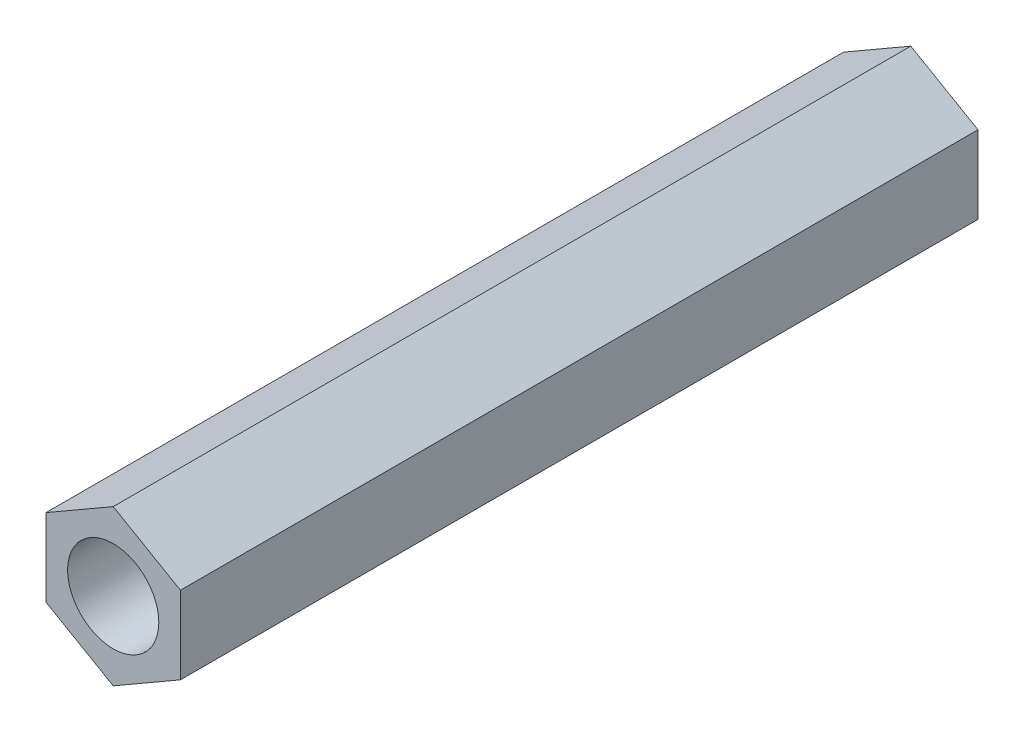
ISO-10303-21;
HEADER;
FILE_DESCRIPTION(('STEP AP214'),'2;1');
FILE_NAME('part.step','',(''),(''),'','','');
FILE_SCHEMA(('AUTOMOTIVE_DESIGN { 1 0 10303 214 1 1 1 1 }'));
ENDSEC;
DATA;
#1=APPLICATION_CONTEXT('core data for automotive mechanical design processes');
#2=APPLICATION_PROTOCOL_DEFINITION('international standard','automotive_design',2000,#1);
#3=PRODUCT_CONTEXT('',#1,'mechanical');
#4=PRODUCT('Part','Part','',(#3));
#5=PRODUCT_RELATED_PRODUCT_CATEGORY('part','',(#4));
#6=PRODUCT_DEFINITION_FORMATION('','',#4);
#7=PRODUCT_DEFINITION_CONTEXT('part definition',#1,'design');
#8=PRODUCT_DEFINITION('design','',#6,#7);
#9=PRODUCT_DEFINITION_SHAPE('','',#8);
#10=(LENGTH_UNIT() NAMED_UNIT(*) SI_UNIT(.MILLI.,.METRE.));
#11=(NAMED_UNIT(*) PLANE_ANGLE_UNIT() SI_UNIT($,.RADIAN.));
#12=(NAMED_UNIT(*) SI_UNIT($,.STERADIAN.) SOLID_ANGLE_UNIT());
#13=UNCERTAINTY_MEASURE_WITH_UNIT(LENGTH_MEASURE(1.E-05),#10,'distance_accuracy_value','');
#14=(GEOMETRIC_REPRESENTATION_CONTEXT(3) GLOBAL_UNCERTAINTY_ASSIGNED_CONTEXT((#13)) GLOBAL_UNIT_ASSIGNED_CONTEXT((#10,
#11,#12)) REPRESENTATION_CONTEXT('',''));
#15=CARTESIAN_POINT('',(0.,0.,0.));
#16=DIRECTION('',(0.,0.,1.));
#17=DIRECTION('',(1.,0.,0.));
#18=AXIS2_PLACEMENT_3D('',#15,#16,#17);
#19=CARTESIAN_POINT('',(0.,0.,35.));
#20=DIRECTION('',(0.,0.,1.));
#21=DIRECTION('',(1.,0.,0.));
#22=AXIS2_PLACEMENT_3D('',#19,#20,#21);
#23=PLANE('',#22);
#24=DIRECTION('',(0.866025403784439,0.5,0.));
#25=VECTOR('',#24,1.);
#26=CARTESIAN_POINT('',(0.,-3.40636658821879,35.));
#27=LINE('',#26,#25);
#28=CARTESIAN_POINT('',(0.,-3.40636658821879,35.));
#29=VERTEX_POINT('',#28);
#30=CARTESIAN_POINT('',(2.95,-1.7031832941094,35.));
#31=VERTEX_POINT('',#30);
#32=EDGE_CURVE('E154',#29,#31,#27,.T.);
#33=ORIENTED_EDGE('',*,*,#32,.T.);
#34=DIRECTION('',(0.,1.,0.));
#35=VECTOR('',#34,1.);
#36=CARTESIAN_POINT('',(2.95,-1.7031832941094,35.));
#37=LINE('',#36,#35);
#38=CARTESIAN_POINT('',(2.95,1.7031832941094,35.));
#39=VERTEX_POINT('',#38);
#40=EDGE_CURVE('E102',#31,#39,#37,.T.);
#41=ORIENTED_EDGE('',*,*,#40,.T.);
#42=DIRECTION('',(-0.866025403784439,0.5,0.));
#43=VECTOR('',#42,1.);
#44=CARTESIAN_POINT('',(2.95,1.7031832941094,35.));
#45=LINE('',#44,#43);
#46=CARTESIAN_POINT('',(0.,3.40636658821879,35.));
#47=VERTEX_POINT('',#46);
#48=EDGE_CURVE('E115',#39,#47,#45,.T.);
#49=ORIENTED_EDGE('',*,*,#48,.T.);
#50=DIRECTION('',(-0.866025403784439,-0.5,0.));
#51=VECTOR('',#50,1.);
#52=CARTESIAN_POINT('',(0.,3.40636658821879,35.));
#53=LINE('',#52,#51);
#54=CARTESIAN_POINT('',(-2.95,1.7031832941094,35.));
#55=VERTEX_POINT('',#54);
#56=EDGE_CURVE('E109',#47,#55,#53,.T.);
#57=ORIENTED_EDGE('',*,*,#56,.T.);
#58=DIRECTION('',(0.,-1.,0.));
#59=VECTOR('',#58,1.);
#60=CARTESIAN_POINT('',(-2.95,1.7031832941094,35.));
#61=LINE('',#60,#59);
#62=CARTESIAN_POINT('',(-2.95,-1.7031832941094,35.));
#63=VERTEX_POINT('',#62);
#64=EDGE_CURVE('E113',#55,#63,#61,.T.);
#65=ORIENTED_EDGE('',*,*,#64,.T.);
#66=DIRECTION('',(0.866025403784438,-0.5,0.));
#67=VECTOR('',#66,1.);
#68=CARTESIAN_POINT('',(-2.95,-1.7031832941094,35.));
#69=LINE('',#68,#67);
#70=EDGE_CURVE('E65',#63,#29,#69,.T.);
#71=ORIENTED_EDGE('',*,*,#70,.T.);
#72=EDGE_LOOP('',(#33,#41,#49,#57,#65,#71));
#73=FACE_BOUND('',#72,.T.);
#74=CARTESIAN_POINT('',(0.,0.,35.));
#75=DIRECTION('',(0.,0.,1.));
#76=DIRECTION('',(1.,0.,0.));
#77=AXIS2_PLACEMENT_3D('',#74,#75,#76);
#78=CIRCLE('',#77,2.);
#79=CARTESIAN_POINT('',(2.,0.,35.));
#80=VERTEX_POINT('',#79);
#81=EDGE_CURVE('E142',#80,#80,#78,.T.);
#82=ORIENTED_EDGE('',*,*,#81,.F.);
#83=EDGE_LOOP('',(#82));
#84=FACE_BOUND('',#83,.T.);
#85=ADVANCED_FACE('F47',(#73,#84),#23,.T.);
#86=CARTESIAN_POINT('',(0.,0.,0.));
#87=DIRECTION('',(0.,0.,1.));
#88=DIRECTION('',(1.,0.,0.));
#89=AXIS2_PLACEMENT_3D('',#86,#87,#88);
#90=PLANE('',#89);
#91=DIRECTION('',(0.866025403784439,0.5,0.));
#92=VECTOR('',#91,1.);
#93=CARTESIAN_POINT('',(0.,-3.40636658821879,0.));
#94=LINE('',#93,#92);
#95=CARTESIAN_POINT('',(0.,-3.40636658821879,0.));
#96=VERTEX_POINT('',#95);
#97=CARTESIAN_POINT('',(2.95,-1.7031832941094,0.));
#98=VERTEX_POINT('',#97);
#99=EDGE_CURVE('E137',#96,#98,#94,.T.);
#100=ORIENTED_EDGE('',*,*,#99,.F.);
#101=DIRECTION('',(0.866025403784438,-0.5,0.));
#102=VECTOR('',#101,1.);
#103=CARTESIAN_POINT('',(-2.95,-1.7031832941094,0.));
#104=LINE('',#103,#102);
#105=CARTESIAN_POINT('',(-2.95,-1.7031832941094,0.));
#106=VERTEX_POINT('',#105);
#107=EDGE_CURVE('E94',#106,#96,#104,.T.);
#108=ORIENTED_EDGE('',*,*,#107,.F.);
#109=DIRECTION('',(0.,-1.,0.));
#110=VECTOR('',#109,1.);
#111=CARTESIAN_POINT('',(-2.95,1.7031832941094,0.));
#112=LINE('',#111,#110);
#113=CARTESIAN_POINT('',(-2.95,1.7031832941094,0.));
#114=VERTEX_POINT('',#113);
#115=EDGE_CURVE('E88',#114,#106,#112,.T.);
#116=ORIENTED_EDGE('',*,*,#115,.F.);
#117=DIRECTION('',(-0.866025403784439,-0.5,0.));
#118=VECTOR('',#117,1.);
#119=CARTESIAN_POINT('',(0.,3.40636658821879,0.));
#120=LINE('',#119,#118);
#121=CARTESIAN_POINT('',(0.,3.40636658821879,0.));
#122=VERTEX_POINT('',#121);
#123=EDGE_CURVE('E124',#122,#114,#120,.T.);
#124=ORIENTED_EDGE('',*,*,#123,.F.);
#125=DIRECTION('',(-0.866025403784439,0.5,0.));
#126=VECTOR('',#125,1.);
#127=CARTESIAN_POINT('',(2.95,1.7031832941094,0.));
#128=LINE('',#127,#126);
#129=CARTESIAN_POINT('',(2.95,1.7031832941094,0.));
#130=VERTEX_POINT('',#129);
#131=EDGE_CURVE('E145',#130,#122,#128,.T.);
#132=ORIENTED_EDGE('',*,*,#131,.F.);
#133=DIRECTION('',(0.,1.,0.));
#134=VECTOR('',#133,1.);
#135=CARTESIAN_POINT('',(2.95,-1.7031832941094,0.));
#136=LINE('',#135,#134);
#137=EDGE_CURVE('E141',#98,#130,#136,.T.);
#138=ORIENTED_EDGE('',*,*,#137,.F.);
#139=EDGE_LOOP('',(#100,#108,#116,#124,#132,#138));
#140=FACE_BOUND('',#139,.T.);
#141=CARTESIAN_POINT('',(0.,0.,0.));
#142=DIRECTION('',(0.,0.,1.));
#143=DIRECTION('',(1.,0.,0.));
#144=AXIS2_PLACEMENT_3D('',#141,#142,#143);
#145=CIRCLE('',#144,2.);
#146=CARTESIAN_POINT('',(2.,0.,0.));
#147=VERTEX_POINT('',#146);
#148=EDGE_CURVE('E251',#147,#147,#145,.T.);
#149=ORIENTED_EDGE('',*,*,#148,.T.);
#150=EDGE_LOOP('',(#149));
#151=FACE_BOUND('',#150,.T.);
#152=ADVANCED_FACE('F167',(#140,#151),#90,.F.);
#153=CARTESIAN_POINT('',(0.,-3.40636658821879,35.));
#154=DIRECTION('',(-0.5,0.866025403784439,0.));
#155=DIRECTION('',(-0.866025403784439,-0.5,0.));
#156=AXIS2_PLACEMENT_3D('',#153,#154,#155);
#157=PLANE('',#156);
#158=ORIENTED_EDGE('',*,*,#99,.T.);
#159=DIRECTION('',(0.,0.,-1.));
#160=VECTOR('',#159,1.);
#161=CARTESIAN_POINT('',(2.95,-1.7031832941094,35.));
#162=LINE('',#161,#160);
#163=EDGE_CURVE('E11',#31,#98,#162,.T.);
#164=ORIENTED_EDGE('',*,*,#163,.F.);
#165=ORIENTED_EDGE('',*,*,#32,.F.);
#166=DIRECTION('',(0.,0.,-1.));
#167=VECTOR('',#166,1.);
#168=CARTESIAN_POINT('',(0.,-3.40636658821879,35.));
#169=LINE('',#168,#167);
#170=EDGE_CURVE('E133',#29,#96,#169,.T.);
#171=ORIENTED_EDGE('',*,*,#170,.T.);
#172=EDGE_LOOP('',(#158,#164,#165,#171));
#173=FACE_BOUND('',#172,.T.);
#174=ADVANCED_FACE('F49',(#173),#157,.F.);
#175=CARTESIAN_POINT('',(2.95,-1.7031832941094,35.));
#176=DIRECTION('',(-1.,0.,0.));
#177=DIRECTION('',(0.,0.,1.));
#178=AXIS2_PLACEMENT_3D('',#175,#176,#177);
#179=PLANE('',#178);
#180=ORIENTED_EDGE('',*,*,#137,.T.);
#181=DIRECTION('',(0.,0.,-1.));
#182=VECTOR('',#181,1.);
#183=CARTESIAN_POINT('',(2.95,1.7031832941094,35.));
#184=LINE('',#183,#182);
#185=EDGE_CURVE('E57',#39,#130,#184,.T.);
#186=ORIENTED_EDGE('',*,*,#185,.F.);
#187=ORIENTED_EDGE('',*,*,#40,.F.);
#188=ORIENTED_EDGE('',*,*,#163,.T.);
#189=EDGE_LOOP('',(#180,#186,#187,#188));
#190=FACE_BOUND('',#189,.T.);
#191=ADVANCED_FACE('F192',(#190),#179,.F.);
#192=CARTESIAN_POINT('',(2.95,1.7031832941094,35.));
#193=DIRECTION('',(-0.5,-0.866025403784439,0.));
#194=DIRECTION('',(0.866025403784439,-0.5,0.));
#195=AXIS2_PLACEMENT_3D('',#192,#193,#194);
#196=PLANE('',#195);
#197=ORIENTED_EDGE('',*,*,#131,.T.);
#198=DIRECTION('',(0.,0.,-1.));
#199=VECTOR('',#198,1.);
#200=CARTESIAN_POINT('',(0.,3.40636658821879,35.));
#201=LINE('',#200,#199);
#202=EDGE_CURVE('E126',#47,#122,#201,.T.);
#203=ORIENTED_EDGE('',*,*,#202,.F.);
#204=ORIENTED_EDGE('',*,*,#48,.F.);
#205=ORIENTED_EDGE('',*,*,#185,.T.);
#206=EDGE_LOOP('',(#197,#203,#204,#205));
#207=FACE_BOUND('',#206,.T.);
#208=ADVANCED_FACE('F164',(#207),#196,.F.);
#209=CARTESIAN_POINT('',(0.,3.40636658821879,35.));
#210=DIRECTION('',(0.5,-0.866025403784439,0.));
#211=DIRECTION('',(0.866025403784439,0.5,0.));
#212=AXIS2_PLACEMENT_3D('',#209,#210,#211);
#213=PLANE('',#212);
#214=ORIENTED_EDGE('',*,*,#123,.T.);
#215=DIRECTION('',(0.,0.,-1.));
#216=VECTOR('',#215,1.);
#217=CARTESIAN_POINT('',(-2.95,1.7031832941094,35.));
#218=LINE('',#217,#216);
#219=EDGE_CURVE('E121',#55,#114,#218,.T.);
#220=ORIENTED_EDGE('',*,*,#219,.F.);
#221=ORIENTED_EDGE('',*,*,#56,.F.);
#222=ORIENTED_EDGE('',*,*,#202,.T.);
#223=EDGE_LOOP('',(#214,#220,#221,#222));
#224=FACE_BOUND('',#223,.T.);
#225=ADVANCED_FACE('F122',(#224),#213,.F.);
#226=CARTESIAN_POINT('',(-2.95,1.7031832941094,35.));
#227=DIRECTION('',(1.,0.,0.));
#228=DIRECTION('',(0.,1.,0.));
#229=AXIS2_PLACEMENT_3D('',#226,#227,#228);
#230=PLANE('',#229);
#231=ORIENTED_EDGE('',*,*,#115,.T.);
#232=DIRECTION('',(0.,0.,-1.));
#233=VECTOR('',#232,1.);
#234=CARTESIAN_POINT('',(-2.95,-1.7031832941094,35.));
#235=LINE('',#234,#233);
#236=EDGE_CURVE('E127',#63,#106,#235,.T.);
#237=ORIENTED_EDGE('',*,*,#236,.F.);
#238=ORIENTED_EDGE('',*,*,#64,.F.);
#239=ORIENTED_EDGE('',*,*,#219,.T.);
#240=EDGE_LOOP('',(#231,#237,#238,#239));
#241=FACE_BOUND('',#240,.T.);
#242=ADVANCED_FACE('F129',(#241),#230,.F.);
#243=CARTESIAN_POINT('',(-2.95,-1.7031832941094,35.));
#244=DIRECTION('',(0.5,0.866025403784439,0.));
#245=DIRECTION('',(-0.866025403784439,0.5,0.));
#246=AXIS2_PLACEMENT_3D('',#243,#244,#245);
#247=PLANE('',#246);
#248=ORIENTED_EDGE('',*,*,#107,.T.);
#249=ORIENTED_EDGE('',*,*,#170,.F.);
#250=ORIENTED_EDGE('',*,*,#70,.F.);
#251=ORIENTED_EDGE('',*,*,#236,.T.);
#252=EDGE_LOOP('',(#248,#249,#250,#251));
#253=FACE_BOUND('',#252,.T.);
#254=ADVANCED_FACE('F172',(#253),#247,.F.);
#255=CARTESIAN_POINT('',(0.,0.,35.));
#256=DIRECTION('',(0.,0.,-1.));
#257=DIRECTION('',(-1.,0.,0.));
#258=AXIS2_PLACEMENT_3D('',#255,#256,#257);
#259=CYLINDRICAL_SURFACE('',#258,2.);
#260=ORIENTED_EDGE('',*,*,#81,.T.);
#261=EDGE_LOOP('',(#260));
#262=FACE_BOUND('',#261,.T.);
#263=ORIENTED_EDGE('',*,*,#148,.F.);
#264=EDGE_LOOP('',(#263));
#265=FACE_BOUND('',#264,.T.);
#266=ADVANCED_FACE('F174',(#262,#265),#259,.F.);
#267=CLOSED_SHELL('',(#85,#152,#174,#191,#208,#225,#242,#254,#266));
#268=MANIFOLD_SOLID_BREP('B2',#267);
#269=ADVANCED_BREP_SHAPE_REPRESENTATION('',(#18,#268),#14);
#270=SHAPE_DEFINITION_REPRESENTATION(#9,#269);
ENDSEC;
END-ISO-10303-21;
